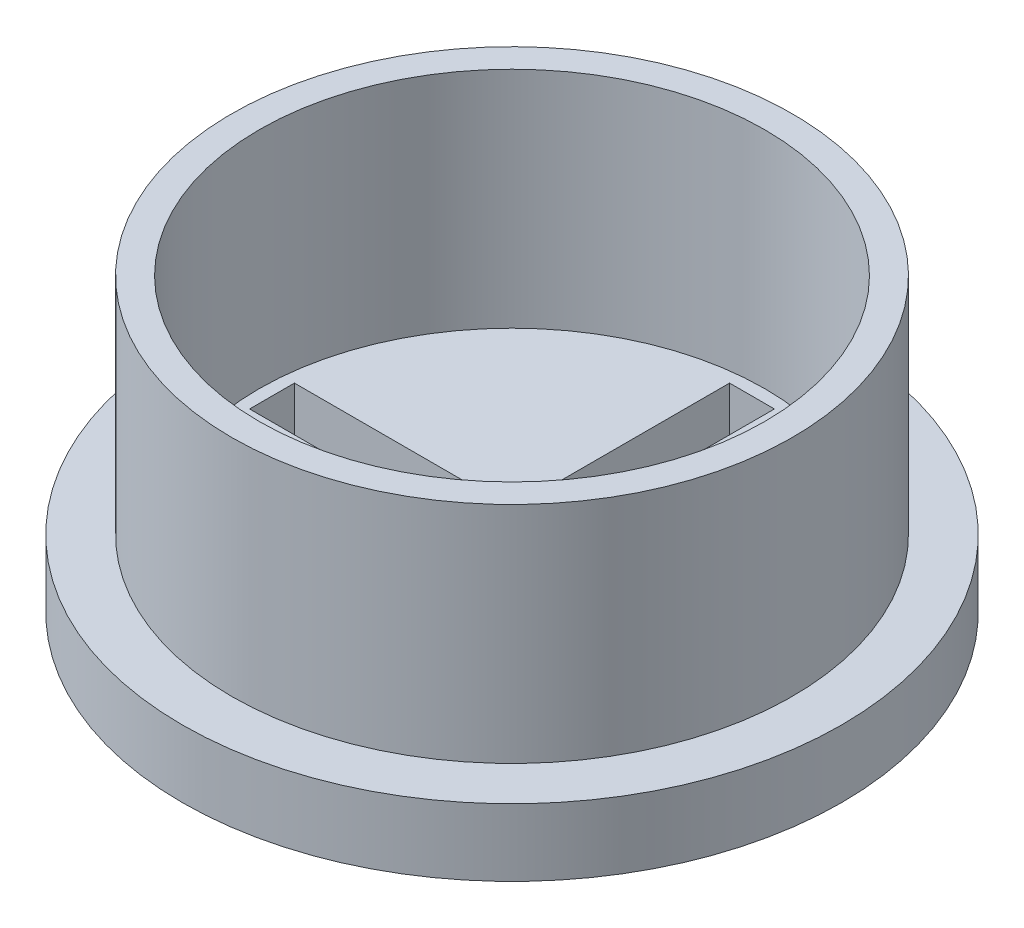
ISO-10303-21;
HEADER;
FILE_DESCRIPTION(('STEP AP214'),'2;1');
FILE_NAME('part.step','',(''),(''),'','','');
FILE_SCHEMA(('AUTOMOTIVE_DESIGN { 1 0 10303 214 1 1 1 1 }'));
ENDSEC;
DATA;
#1=APPLICATION_CONTEXT('core data for automotive mechanical design processes');
#2=APPLICATION_PROTOCOL_DEFINITION('international standard','automotive_design',2000,#1);
#3=PRODUCT_CONTEXT('',#1,'mechanical');
#4=PRODUCT('Part','Part','',(#3));
#5=PRODUCT_RELATED_PRODUCT_CATEGORY('part','',(#4));
#6=PRODUCT_DEFINITION_FORMATION('','',#4);
#7=PRODUCT_DEFINITION_CONTEXT('part definition',#1,'design');
#8=PRODUCT_DEFINITION('design','',#6,#7);
#9=PRODUCT_DEFINITION_SHAPE('','',#8);
#10=(LENGTH_UNIT() NAMED_UNIT(*) SI_UNIT(.MILLI.,.METRE.));
#11=(NAMED_UNIT(*) PLANE_ANGLE_UNIT() SI_UNIT($,.RADIAN.));
#12=(NAMED_UNIT(*) SI_UNIT($,.STERADIAN.) SOLID_ANGLE_UNIT());
#13=UNCERTAINTY_MEASURE_WITH_UNIT(LENGTH_MEASURE(1.E-05),#10,'distance_accuracy_value','');
#14=(GEOMETRIC_REPRESENTATION_CONTEXT(3) GLOBAL_UNCERTAINTY_ASSIGNED_CONTEXT((#13)) GLOBAL_UNIT_ASSIGNED_CONTEXT((#10,
#11,#12)) REPRESENTATION_CONTEXT('',''));
#15=CARTESIAN_POINT('',(0.,0.,0.));
#16=DIRECTION('',(0.,0.,1.));
#17=DIRECTION('',(1.,0.,0.));
#18=AXIS2_PLACEMENT_3D('',#15,#16,#17);
#19=CARTESIAN_POINT('',(-10.7,0.,-1.));
#20=DIRECTION('',(0.,0.,1.));
#21=DIRECTION('',(1.,0.,0.));
#22=AXIS2_PLACEMENT_3D('',#19,#20,#21);
#23=PLANE('',#22);
#24=DIRECTION('',(0.,1.,0.));
#25=VECTOR('',#24,1.);
#26=CARTESIAN_POINT('',(1.,0.,-1.));
#27=LINE('',#26,#25);
#28=CARTESIAN_POINT('',(1.,0.,-0.999999999999999));
#29=VERTEX_POINT('',#28);
#30=CARTESIAN_POINT('',(1.,3.,-0.999999999999999));
#31=VERTEX_POINT('',#30);
#32=EDGE_CURVE('E142',#29,#31,#27,.T.);
#33=ORIENTED_EDGE('',*,*,#32,.F.);
#34=DIRECTION('',(1.,0.,0.));
#35=VECTOR('',#34,1.);
#36=CARTESIAN_POINT('',(-10.7,0.,-1.));
#37=LINE('',#36,#35);
#38=CARTESIAN_POINT('',(10.7,0.,-1.));
#39=VERTEX_POINT('',#38);
#40=EDGE_CURVE('E175',#29,#39,#37,.T.);
#41=ORIENTED_EDGE('',*,*,#40,.T.);
#42=DIRECTION('',(0.,1.,0.));
#43=VECTOR('',#42,1.);
#44=CARTESIAN_POINT('',(10.7,0.,-1.));
#45=LINE('',#44,#43);
#46=CARTESIAN_POINT('',(10.7,3.,-1.));
#47=VERTEX_POINT('',#46);
#48=EDGE_CURVE('E194',#39,#47,#45,.T.);
#49=ORIENTED_EDGE('',*,*,#48,.T.);
#50=DIRECTION('',(1.,0.,0.));
#51=VECTOR('',#50,1.);
#52=CARTESIAN_POINT('',(-10.7,3.,-1.));
#53=LINE('',#52,#51);
#54=EDGE_CURVE('E188',#31,#47,#53,.T.);
#55=ORIENTED_EDGE('',*,*,#54,.F.);
#56=EDGE_LOOP('',(#33,#41,#49,#55));
#57=FACE_BOUND('',#56,.T.);
#58=ADVANCED_FACE('F33',(#57),#23,.T.);
#59=CARTESIAN_POINT('',(-10.7,0.,1.));
#60=DIRECTION('',(0.,0.,1.));
#61=DIRECTION('',(1.,0.,0.));
#62=AXIS2_PLACEMENT_3D('',#59,#60,#61);
#63=PLANE('',#62);
#64=DIRECTION('',(1.,0.,0.));
#65=VECTOR('',#64,1.);
#66=CARTESIAN_POINT('',(-10.7,0.,1.));
#67=LINE('',#66,#65);
#68=CARTESIAN_POINT('',(1.,0.,1.));
#69=VERTEX_POINT('',#68);
#70=CARTESIAN_POINT('',(10.7,0.,1.));
#71=VERTEX_POINT('',#70);
#72=EDGE_CURVE('E56',#69,#71,#67,.T.);
#73=ORIENTED_EDGE('',*,*,#72,.F.);
#74=DIRECTION('',(0.,1.,0.));
#75=VECTOR('',#74,1.);
#76=CARTESIAN_POINT('',(1.,0.,1.));
#77=LINE('',#76,#75);
#78=CARTESIAN_POINT('',(1.,3.,1.));
#79=VERTEX_POINT('',#78);
#80=EDGE_CURVE('E11',#69,#79,#77,.T.);
#81=ORIENTED_EDGE('',*,*,#80,.T.);
#82=DIRECTION('',(1.,0.,0.));
#83=VECTOR('',#82,1.);
#84=CARTESIAN_POINT('',(-10.7,3.,1.));
#85=LINE('',#84,#83);
#86=CARTESIAN_POINT('',(10.7,3.,1.));
#87=VERTEX_POINT('',#86);
#88=EDGE_CURVE('E182',#79,#87,#85,.T.);
#89=ORIENTED_EDGE('',*,*,#88,.T.);
#90=DIRECTION('',(0.,1.,0.));
#91=VECTOR('',#90,1.);
#92=CARTESIAN_POINT('',(10.7,0.,1.));
#93=LINE('',#92,#91);
#94=EDGE_CURVE('E197',#71,#87,#93,.T.);
#95=ORIENTED_EDGE('',*,*,#94,.F.);
#96=EDGE_LOOP('',(#73,#81,#89,#95));
#97=FACE_BOUND('',#96,.T.);
#98=ADVANCED_FACE('F245',(#97),#63,.F.);
#99=CARTESIAN_POINT('',(0.,3.,0.));
#100=DIRECTION('',(0.,-1.,0.));
#101=DIRECTION('',(0.,0.,-1.));
#102=AXIS2_PLACEMENT_3D('',#99,#100,#101);
#103=CYLINDRICAL_SURFACE('',#102,14.7);
#104=CARTESIAN_POINT('',(0.,3.,0.));
#105=DIRECTION('',(0.,1.,0.));
#106=DIRECTION('',(0.,0.,1.));
#107=AXIS2_PLACEMENT_3D('',#104,#105,#106);
#108=CIRCLE('',#107,14.7);
#109=CARTESIAN_POINT('',(0.,3.,14.7));
#110=VERTEX_POINT('',#109);
#111=EDGE_CURVE('E202',#110,#110,#108,.T.);
#112=ORIENTED_EDGE('',*,*,#111,.F.);
#113=EDGE_LOOP('',(#112));
#114=FACE_BOUND('',#113,.T.);
#115=CARTESIAN_POINT('',(0.,0.,0.));
#116=DIRECTION('',(0.,1.,0.));
#117=DIRECTION('',(0.,0.,1.));
#118=AXIS2_PLACEMENT_3D('',#115,#116,#117);
#119=CIRCLE('',#118,14.7);
#120=CARTESIAN_POINT('',(0.,0.,14.7));
#121=VERTEX_POINT('',#120);
#122=EDGE_CURVE('E193',#121,#121,#119,.T.);
#123=ORIENTED_EDGE('',*,*,#122,.T.);
#124=EDGE_LOOP('',(#123));
#125=FACE_BOUND('',#124,.T.);
#126=ADVANCED_FACE('F35',(#114,#125),#103,.T.);
#127=CARTESIAN_POINT('',(0.,3.,0.));
#128=DIRECTION('',(0.,1.,0.));
#129=DIRECTION('',(0.,0.,1.));
#130=AXIS2_PLACEMENT_3D('',#127,#128,#129);
#131=PLANE('',#130);
#132=CARTESIAN_POINT('',(0.,3.,0.));
#133=DIRECTION('',(0.,1.,0.));
#134=DIRECTION('',(0.,0.,1.));
#135=AXIS2_PLACEMENT_3D('',#132,#133,#134);
#136=CIRCLE('',#135,12.5);
#137=CARTESIAN_POINT('',(0.,3.,12.5));
#138=VERTEX_POINT('',#137);
#139=EDGE_CURVE('E277',#138,#138,#136,.T.);
#140=ORIENTED_EDGE('',*,*,#139,.F.);
#141=EDGE_LOOP('',(#140));
#142=FACE_BOUND('',#141,.T.);
#143=ORIENTED_EDGE('',*,*,#111,.T.);
#144=EDGE_LOOP('',(#143));
#145=FACE_BOUND('',#144,.T.);
#146=ADVANCED_FACE('F308',(#142,#145),#131,.T.);
#147=CARTESIAN_POINT('',(0.,0.,0.));
#148=DIRECTION('',(0.,1.,0.));
#149=DIRECTION('',(0.,0.,1.));
#150=AXIS2_PLACEMENT_3D('',#147,#148,#149);
#151=PLANE('',#150);
#152=DIRECTION('',(1.,0.,0.));
#153=VECTOR('',#152,1.);
#154=CARTESIAN_POINT('',(-0.999999999999999,0.,10.7));
#155=LINE('',#154,#153);
#156=CARTESIAN_POINT('',(-0.999999999999999,0.,10.7));
#157=VERTEX_POINT('',#156);
#158=CARTESIAN_POINT('',(1.,0.,10.7));
#159=VERTEX_POINT('',#158);
#160=EDGE_CURVE('E151',#157,#159,#155,.T.);
#161=ORIENTED_EDGE('',*,*,#160,.T.);
#162=DIRECTION('',(0.,0.,-1.));
#163=VECTOR('',#162,1.);
#164=CARTESIAN_POINT('',(0.999999999999999,0.,-10.7));
#165=LINE('',#164,#163);
#166=EDGE_CURVE('E275',#159,#69,#165,.T.);
#167=ORIENTED_EDGE('',*,*,#166,.T.);
#168=ORIENTED_EDGE('',*,*,#72,.T.);
#169=DIRECTION('',(0.,0.,1.));
#170=VECTOR('',#169,1.);
#171=CARTESIAN_POINT('',(10.7,0.,-1.));
#172=LINE('',#171,#170);
#173=EDGE_CURVE('E172',#39,#71,#172,.T.);
#174=ORIENTED_EDGE('',*,*,#173,.F.);
#175=ORIENTED_EDGE('',*,*,#40,.F.);
#176=CARTESIAN_POINT('',(0.999999999999999,0.,-10.7));
#177=VERTEX_POINT('',#176);
#178=EDGE_CURVE('E224',#29,#177,#165,.T.);
#179=ORIENTED_EDGE('',*,*,#178,.T.);
#180=DIRECTION('',(-1.,0.,0.));
#181=VECTOR('',#180,1.);
#182=CARTESIAN_POINT('',(-1.,0.,-10.7));
#183=LINE('',#182,#181);
#184=CARTESIAN_POINT('',(-1.,0.,-10.7));
#185=VERTEX_POINT('',#184);
#186=EDGE_CURVE('E148',#177,#185,#183,.T.);
#187=ORIENTED_EDGE('',*,*,#186,.T.);
#188=DIRECTION('',(0.,0.,1.));
#189=VECTOR('',#188,1.);
#190=CARTESIAN_POINT('',(-1.,0.,-10.7));
#191=LINE('',#190,#189);
#192=CARTESIAN_POINT('',(-1.,0.,-0.999999999999999));
#193=VERTEX_POINT('',#192);
#194=EDGE_CURVE('E156',#185,#193,#191,.T.);
#195=ORIENTED_EDGE('',*,*,#194,.T.);
#196=CARTESIAN_POINT('',(-10.7,0.,-1.));
#197=VERTEX_POINT('',#196);
#198=EDGE_CURVE('E176',#197,#193,#37,.T.);
#199=ORIENTED_EDGE('',*,*,#198,.F.);
#200=DIRECTION('',(0.,0.,1.));
#201=VECTOR('',#200,1.);
#202=CARTESIAN_POINT('',(-10.7,0.,-1.));
#203=LINE('',#202,#201);
#204=CARTESIAN_POINT('',(-10.7,0.,1.));
#205=VERTEX_POINT('',#204);
#206=EDGE_CURVE('E165',#197,#205,#203,.T.);
#207=ORIENTED_EDGE('',*,*,#206,.T.);
#208=CARTESIAN_POINT('',(-1.,0.,1.));
#209=VERTEX_POINT('',#208);
#210=EDGE_CURVE('E169',#205,#209,#67,.T.);
#211=ORIENTED_EDGE('',*,*,#210,.T.);
#212=EDGE_CURVE('E48',#209,#157,#191,.T.);
#213=ORIENTED_EDGE('',*,*,#212,.T.);
#214=EDGE_LOOP('',(#161,#167,#168,#174,#175,#179,#187,#195,#199,#207,#211,#213));
#215=FACE_BOUND('',#214,.T.);
#216=ORIENTED_EDGE('',*,*,#122,.F.);
#217=EDGE_LOOP('',(#216));
#218=FACE_BOUND('',#217,.T.);
#219=ADVANCED_FACE('F210',(#215,#218),#151,.F.);
#220=CARTESIAN_POINT('',(-10.7,0.,-1.));
#221=DIRECTION('',(-1.,0.,0.));
#222=DIRECTION('',(0.,0.,1.));
#223=AXIS2_PLACEMENT_3D('',#220,#221,#222);
#224=PLANE('',#223);
#225=DIRECTION('',(0.,0.,1.));
#226=VECTOR('',#225,1.);
#227=CARTESIAN_POINT('',(-10.7,3.,-1.));
#228=LINE('',#227,#226);
#229=CARTESIAN_POINT('',(-10.7,3.,-1.));
#230=VERTEX_POINT('',#229);
#231=CARTESIAN_POINT('',(-10.7,3.,1.));
#232=VERTEX_POINT('',#231);
#233=EDGE_CURVE('E164',#230,#232,#228,.T.);
#234=ORIENTED_EDGE('',*,*,#233,.T.);
#235=DIRECTION('',(0.,1.,0.));
#236=VECTOR('',#235,1.);
#237=CARTESIAN_POINT('',(-10.7,0.,1.));
#238=LINE('',#237,#236);
#239=EDGE_CURVE('E179',#205,#232,#238,.T.);
#240=ORIENTED_EDGE('',*,*,#239,.F.);
#241=ORIENTED_EDGE('',*,*,#206,.F.);
#242=DIRECTION('',(0.,1.,0.));
#243=VECTOR('',#242,1.);
#244=CARTESIAN_POINT('',(-10.7,0.,-1.));
#245=LINE('',#244,#243);
#246=EDGE_CURVE('E190',#197,#230,#245,.T.);
#247=ORIENTED_EDGE('',*,*,#246,.T.);
#248=EDGE_LOOP('',(#234,#240,#241,#247));
#249=FACE_BOUND('',#248,.T.);
#250=ADVANCED_FACE('F216',(#249),#224,.F.);
#251=DIRECTION('',(0.,-1.,0.));
#252=VECTOR('',#251,1.);
#253=CARTESIAN_POINT('',(-0.999999999999999,0.,-1.));
#254=LINE('',#253,#252);
#255=CARTESIAN_POINT('',(-1.,3.,-0.999999999999999));
#256=VERTEX_POINT('',#255);
#257=EDGE_CURVE('E160',#256,#193,#254,.T.);
#258=ORIENTED_EDGE('',*,*,#257,.F.);
#259=EDGE_CURVE('E168',#230,#256,#53,.T.);
#260=ORIENTED_EDGE('',*,*,#259,.F.);
#261=ORIENTED_EDGE('',*,*,#246,.F.);
#262=ORIENTED_EDGE('',*,*,#198,.T.);
#263=EDGE_LOOP('',(#258,#260,#261,#262));
#264=FACE_BOUND('',#263,.T.);
#265=ADVANCED_FACE('F248',(#264),#23,.T.);
#266=CARTESIAN_POINT('',(10.7,0.,-1.));
#267=DIRECTION('',(-1.,0.,0.));
#268=DIRECTION('',(0.,0.,1.));
#269=AXIS2_PLACEMENT_3D('',#266,#267,#268);
#270=PLANE('',#269);
#271=DIRECTION('',(0.,0.,1.));
#272=VECTOR('',#271,1.);
#273=CARTESIAN_POINT('',(10.7,3.,-1.));
#274=LINE('',#273,#272);
#275=EDGE_CURVE('E186',#47,#87,#274,.T.);
#276=ORIENTED_EDGE('',*,*,#275,.F.);
#277=ORIENTED_EDGE('',*,*,#48,.F.);
#278=ORIENTED_EDGE('',*,*,#173,.T.);
#279=ORIENTED_EDGE('',*,*,#94,.T.);
#280=EDGE_LOOP('',(#276,#277,#278,#279));
#281=FACE_BOUND('',#280,.T.);
#282=ADVANCED_FACE('F256',(#281),#270,.T.);
#283=CARTESIAN_POINT('',(-1.,3.,1.));
#284=VERTEX_POINT('',#283);
#285=EDGE_CURVE('E183',#232,#284,#85,.T.);
#286=ORIENTED_EDGE('',*,*,#285,.T.);
#287=DIRECTION('',(0.,-1.,0.));
#288=VECTOR('',#287,1.);
#289=CARTESIAN_POINT('',(-0.999999999999999,0.,1.));
#290=LINE('',#289,#288);
#291=EDGE_CURVE('E41',#284,#209,#290,.T.);
#292=ORIENTED_EDGE('',*,*,#291,.T.);
#293=ORIENTED_EDGE('',*,*,#210,.F.);
#294=ORIENTED_EDGE('',*,*,#239,.T.);
#295=EDGE_LOOP('',(#286,#292,#293,#294));
#296=FACE_BOUND('',#295,.T.);
#297=ADVANCED_FACE('F208',(#296),#63,.F.);
#298=CARTESIAN_POINT('',(0.999999999999999,0.,-10.7));
#299=DIRECTION('',(1.,0.,0.));
#300=DIRECTION('',(0.,0.,-1.));
#301=AXIS2_PLACEMENT_3D('',#298,#299,#300);
#302=PLANE('',#301);
#303=ORIENTED_EDGE('',*,*,#166,.F.);
#304=DIRECTION('',(0.,1.,0.));
#305=VECTOR('',#304,1.);
#306=CARTESIAN_POINT('',(1.,0.,10.7));
#307=LINE('',#306,#305);
#308=CARTESIAN_POINT('',(1.,3.,10.7));
#309=VERTEX_POINT('',#308);
#310=EDGE_CURVE('E162',#159,#309,#307,.T.);
#311=ORIENTED_EDGE('',*,*,#310,.T.);
#312=DIRECTION('',(0.,0.,-1.));
#313=VECTOR('',#312,1.);
#314=CARTESIAN_POINT('',(0.999999999999999,3.,-10.7));
#315=LINE('',#314,#313);
#316=EDGE_CURVE('E135',#309,#79,#315,.T.);
#317=ORIENTED_EDGE('',*,*,#316,.T.);
#318=ORIENTED_EDGE('',*,*,#80,.F.);
#319=EDGE_LOOP('',(#303,#311,#317,#318));
#320=FACE_BOUND('',#319,.T.);
#321=ADVANCED_FACE('F231',(#320),#302,.F.);
#322=CARTESIAN_POINT('',(-1.,0.,-10.7));
#323=DIRECTION('',(-1.,0.,0.));
#324=DIRECTION('',(0.,0.,1.));
#325=AXIS2_PLACEMENT_3D('',#322,#323,#324);
#326=PLANE('',#325);
#327=DIRECTION('',(0.,0.,1.));
#328=VECTOR('',#327,1.);
#329=CARTESIAN_POINT('',(-1.,3.,-10.7));
#330=LINE('',#329,#328);
#331=CARTESIAN_POINT('',(-0.999999999999999,3.,10.7));
#332=VERTEX_POINT('',#331);
#333=EDGE_CURVE('E134',#284,#332,#330,.T.);
#334=ORIENTED_EDGE('',*,*,#333,.T.);
#335=DIRECTION('',(0.,1.,0.));
#336=VECTOR('',#335,1.);
#337=CARTESIAN_POINT('',(-0.999999999999999,0.,10.7));
#338=LINE('',#337,#336);
#339=EDGE_CURVE('E153',#157,#332,#338,.T.);
#340=ORIENTED_EDGE('',*,*,#339,.F.);
#341=ORIENTED_EDGE('',*,*,#212,.F.);
#342=ORIENTED_EDGE('',*,*,#291,.F.);
#343=EDGE_LOOP('',(#334,#340,#341,#342));
#344=FACE_BOUND('',#343,.T.);
#345=ADVANCED_FACE('F229',(#344),#326,.F.);
#346=CARTESIAN_POINT('',(-0.999999999999999,0.,10.7));
#347=DIRECTION('',(0.,0.,1.));
#348=DIRECTION('',(1.,0.,0.));
#349=AXIS2_PLACEMENT_3D('',#346,#347,#348);
#350=PLANE('',#349);
#351=DIRECTION('',(1.,0.,0.));
#352=VECTOR('',#351,1.);
#353=CARTESIAN_POINT('',(-0.999999999999999,3.,10.7));
#354=LINE('',#353,#352);
#355=EDGE_CURVE('E219',#332,#309,#354,.T.);
#356=ORIENTED_EDGE('',*,*,#355,.T.);
#357=ORIENTED_EDGE('',*,*,#310,.F.);
#358=ORIENTED_EDGE('',*,*,#160,.F.);
#359=ORIENTED_EDGE('',*,*,#339,.T.);
#360=EDGE_LOOP('',(#356,#357,#358,#359));
#361=FACE_BOUND('',#360,.T.);
#362=ADVANCED_FACE('F228',(#361),#350,.F.);
#363=ORIENTED_EDGE('',*,*,#32,.T.);
#364=CARTESIAN_POINT('',(0.999999999999999,3.,-10.7));
#365=VERTEX_POINT('',#364);
#366=EDGE_CURVE('E127',#31,#365,#315,.T.);
#367=ORIENTED_EDGE('',*,*,#366,.T.);
#368=DIRECTION('',(0.,1.,0.));
#369=VECTOR('',#368,1.);
#370=CARTESIAN_POINT('',(0.999999999999999,0.,-10.7));
#371=LINE('',#370,#369);
#372=EDGE_CURVE('E139',#177,#365,#371,.T.);
#373=ORIENTED_EDGE('',*,*,#372,.F.);
#374=ORIENTED_EDGE('',*,*,#178,.F.);
#375=EDGE_LOOP('',(#363,#367,#373,#374));
#376=FACE_BOUND('',#375,.T.);
#377=ADVANCED_FACE('F138',(#376),#302,.F.);
#378=ORIENTED_EDGE('',*,*,#257,.T.);
#379=ORIENTED_EDGE('',*,*,#194,.F.);
#380=DIRECTION('',(0.,1.,0.));
#381=VECTOR('',#380,1.);
#382=CARTESIAN_POINT('',(-1.,0.,-10.7));
#383=LINE('',#382,#381);
#384=CARTESIAN_POINT('',(-1.,3.,-10.7));
#385=VERTEX_POINT('',#384);
#386=EDGE_CURVE('E150',#185,#385,#383,.T.);
#387=ORIENTED_EDGE('',*,*,#386,.T.);
#388=EDGE_CURVE('E130',#385,#256,#330,.T.);
#389=ORIENTED_EDGE('',*,*,#388,.T.);
#390=EDGE_LOOP('',(#378,#379,#387,#389));
#391=FACE_BOUND('',#390,.T.);
#392=ADVANCED_FACE('F233',(#391),#326,.F.);
#393=CARTESIAN_POINT('',(-1.,0.,-10.7));
#394=DIRECTION('',(0.,0.,-1.));
#395=DIRECTION('',(-1.,0.,0.));
#396=AXIS2_PLACEMENT_3D('',#393,#394,#395);
#397=PLANE('',#396);
#398=DIRECTION('',(-1.,0.,0.));
#399=VECTOR('',#398,1.);
#400=CARTESIAN_POINT('',(-1.,3.,-10.7));
#401=LINE('',#400,#399);
#402=EDGE_CURVE('E124',#365,#385,#401,.T.);
#403=ORIENTED_EDGE('',*,*,#402,.T.);
#404=ORIENTED_EDGE('',*,*,#386,.F.);
#405=ORIENTED_EDGE('',*,*,#186,.F.);
#406=ORIENTED_EDGE('',*,*,#372,.T.);
#407=EDGE_LOOP('',(#403,#404,#405,#406));
#408=FACE_BOUND('',#407,.T.);
#409=ADVANCED_FACE('F146',(#408),#397,.F.);
#410=CARTESIAN_POINT('',(0.,13.,0.));
#411=DIRECTION('',(0.,-1.,0.));
#412=DIRECTION('',(0.,0.,-1.));
#413=AXIS2_PLACEMENT_3D('',#410,#411,#412);
#414=CYLINDRICAL_SURFACE('',#413,12.5);
#415=CARTESIAN_POINT('',(0.,13.,0.));
#416=DIRECTION('',(0.,1.,0.));
#417=DIRECTION('',(0.,0.,1.));
#418=AXIS2_PLACEMENT_3D('',#415,#416,#417);
#419=CIRCLE('',#418,12.5);
#420=CARTESIAN_POINT('',(0.,13.,12.5));
#421=VERTEX_POINT('',#420);
#422=EDGE_CURVE('E144',#421,#421,#419,.T.);
#423=ORIENTED_EDGE('',*,*,#422,.F.);
#424=EDGE_LOOP('',(#423));
#425=FACE_BOUND('',#424,.T.);
#426=ORIENTED_EDGE('',*,*,#139,.T.);
#427=EDGE_LOOP('',(#426));
#428=FACE_BOUND('',#427,.T.);
#429=ADVANCED_FACE('F299',(#425,#428),#414,.T.);
#430=CARTESIAN_POINT('',(0.,13.,0.));
#431=DIRECTION('',(0.,1.,0.));
#432=DIRECTION('',(0.,0.,1.));
#433=AXIS2_PLACEMENT_3D('',#430,#431,#432);
#434=PLANE('',#433);
#435=CARTESIAN_POINT('',(0.,13.,0.));
#436=DIRECTION('',(0.,1.,0.));
#437=DIRECTION('',(0.,0.,1.));
#438=AXIS2_PLACEMENT_3D('',#435,#436,#437);
#439=CIRCLE('',#438,11.27);
#440=CARTESIAN_POINT('',(0.,13.,11.27));
#441=VERTEX_POINT('',#440);
#442=EDGE_CURVE('E283',#441,#441,#439,.T.);
#443=ORIENTED_EDGE('',*,*,#442,.F.);
#444=EDGE_LOOP('',(#443));
#445=FACE_BOUND('',#444,.T.);
#446=ORIENTED_EDGE('',*,*,#422,.T.);
#447=EDGE_LOOP('',(#446));
#448=FACE_BOUND('',#447,.T.);
#449=ADVANCED_FACE('F296',(#445,#448),#434,.T.);
#450=CARTESIAN_POINT('',(0.,3.,0.));
#451=DIRECTION('',(0.,1.,0.));
#452=DIRECTION('',(0.,0.,1.));
#453=AXIS2_PLACEMENT_3D('',#450,#451,#452);
#454=PLANE('',#453);
#455=CARTESIAN_POINT('',(0.,3.,0.));
#456=DIRECTION('',(0.,1.,0.));
#457=DIRECTION('',(0.,0.,1.));
#458=AXIS2_PLACEMENT_3D('',#455,#456,#457);
#459=CIRCLE('',#458,11.27);
#460=CARTESIAN_POINT('',(0.,3.,11.27));
#461=VERTEX_POINT('',#460);
#462=EDGE_CURVE('E280',#461,#461,#459,.T.);
#463=ORIENTED_EDGE('',*,*,#462,.T.);
#464=EDGE_LOOP('',(#463));
#465=FACE_BOUND('',#464,.T.);
#466=ORIENTED_EDGE('',*,*,#355,.F.);
#467=ORIENTED_EDGE('',*,*,#333,.F.);
#468=ORIENTED_EDGE('',*,*,#285,.F.);
#469=ORIENTED_EDGE('',*,*,#233,.F.);
#470=ORIENTED_EDGE('',*,*,#259,.T.);
#471=ORIENTED_EDGE('',*,*,#388,.F.);
#472=ORIENTED_EDGE('',*,*,#402,.F.);
#473=ORIENTED_EDGE('',*,*,#366,.F.);
#474=ORIENTED_EDGE('',*,*,#54,.T.);
#475=ORIENTED_EDGE('',*,*,#275,.T.);
#476=ORIENTED_EDGE('',*,*,#88,.F.);
#477=ORIENTED_EDGE('',*,*,#316,.F.);
#478=EDGE_LOOP('',(#466,#467,#468,#469,#470,#471,#472,#473,#474,#475,#476,#477));
#479=FACE_BOUND('',#478,.T.);
#480=ADVANCED_FACE('F126',(#465,#479),#454,.T.);
#481=CARTESIAN_POINT('',(0.,3.,0.));
#482=DIRECTION('',(0.,1.,0.));
#483=DIRECTION('',(0.,0.,1.));
#484=AXIS2_PLACEMENT_3D('',#481,#482,#483);
#485=CYLINDRICAL_SURFACE('',#484,11.27);
#486=ORIENTED_EDGE('',*,*,#462,.F.);
#487=EDGE_LOOP('',(#486));
#488=FACE_BOUND('',#487,.T.);
#489=ORIENTED_EDGE('',*,*,#442,.T.);
#490=EDGE_LOOP('',(#489));
#491=FACE_BOUND('',#490,.T.);
#492=ADVANCED_FACE('F290',(#488,#491),#485,.F.);
#493=CLOSED_SHELL('',(#58,#98,#126,#146,#219,#250,#265,#282,#297,#321,#345,#362,#377,#392,#409,
#429,#449,#480,#492));
#494=MANIFOLD_SOLID_BREP('B2',#493);
#495=ADVANCED_BREP_SHAPE_REPRESENTATION('',(#18,#494),#14);
#496=SHAPE_DEFINITION_REPRESENTATION(#9,#495);
ENDSEC;
END-ISO-10303-21;
